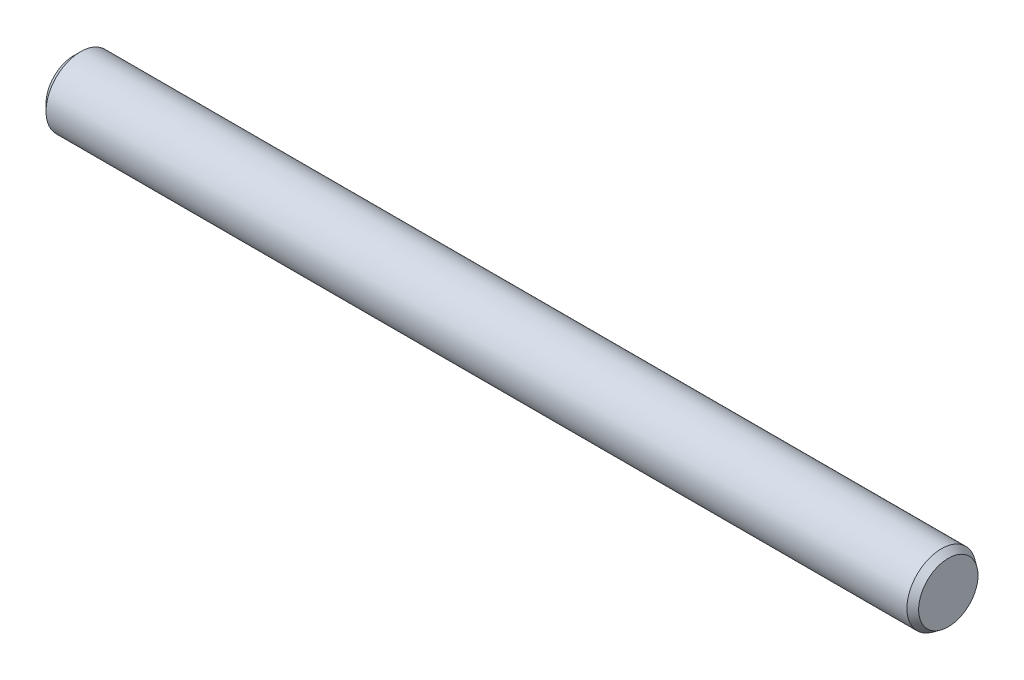
ISO-10303-21;
HEADER;
FILE_DESCRIPTION(('STEP AP214'),'2;1');
FILE_NAME('part.step','',(''),(''),'','','');
FILE_SCHEMA(('AUTOMOTIVE_DESIGN { 1 0 10303 214 1 1 1 1 }'));
ENDSEC;
DATA;
#1=APPLICATION_CONTEXT('core data for automotive mechanical design processes');
#2=APPLICATION_PROTOCOL_DEFINITION('international standard','automotive_design',2000,#1);
#3=PRODUCT_CONTEXT('',#1,'mechanical');
#4=PRODUCT('Part','Part','',(#3));
#5=PRODUCT_RELATED_PRODUCT_CATEGORY('part','',(#4));
#6=PRODUCT_DEFINITION_FORMATION('','',#4);
#7=PRODUCT_DEFINITION_CONTEXT('part definition',#1,'design');
#8=PRODUCT_DEFINITION('design','',#6,#7);
#9=PRODUCT_DEFINITION_SHAPE('','',#8);
#10=(LENGTH_UNIT() NAMED_UNIT(*) SI_UNIT(.MILLI.,.METRE.));
#11=(NAMED_UNIT(*) PLANE_ANGLE_UNIT() SI_UNIT($,.RADIAN.));
#12=(NAMED_UNIT(*) SI_UNIT($,.STERADIAN.) SOLID_ANGLE_UNIT());
#13=UNCERTAINTY_MEASURE_WITH_UNIT(LENGTH_MEASURE(1.E-05),#10,'distance_accuracy_value','');
#14=(GEOMETRIC_REPRESENTATION_CONTEXT(3) GLOBAL_UNCERTAINTY_ASSIGNED_CONTEXT((#13)) GLOBAL_UNIT_ASSIGNED_CONTEXT((#10,
#11,#12)) REPRESENTATION_CONTEXT('',''));
#15=CARTESIAN_POINT('',(0.,0.,0.));
#16=DIRECTION('',(0.,0.,1.));
#17=DIRECTION('',(1.,0.,0.));
#18=AXIS2_PLACEMENT_3D('',#15,#16,#17);
#19=CARTESIAN_POINT('',(-25.2,-39.1906604474953,-59.3361518326643));
#20=DIRECTION('',(1.,0.,0.));
#21=DIRECTION('',(0.,0.,-1.));
#22=AXIS2_PLACEMENT_3D('',#19,#20,#21);
#23=CYLINDRICAL_SURFACE('',#22,1.5);
#24=CARTESIAN_POINT('',(-24.9,-39.1906604474953,-59.3361518326643));
#25=DIRECTION('',(1.,0.,0.));
#26=DIRECTION('',(0.,0.,-1.));
#27=AXIS2_PLACEMENT_3D('',#24,#25,#26);
#28=CIRCLE('',#27,1.5);
#29=CARTESIAN_POINT('',(-24.9,-39.1906604474953,-60.8361518326643));
#30=VERTEX_POINT('',#29);
#31=EDGE_CURVE('E36',#30,#30,#28,.T.);
#32=ORIENTED_EDGE('',*,*,#31,.T.);
#33=EDGE_LOOP('',(#32));
#34=FACE_BOUND('',#33,.T.);
#35=CARTESIAN_POINT('',(12.5,-39.1906604474953,-59.3361518326643));
#36=DIRECTION('',(1.,0.,0.));
#37=DIRECTION('',(0.,0.,-1.));
#38=AXIS2_PLACEMENT_3D('',#35,#36,#37);
#39=CIRCLE('',#38,1.5);
#40=CARTESIAN_POINT('',(12.5,-39.1906604474953,-60.8361518326643));
#41=VERTEX_POINT('',#40);
#42=EDGE_CURVE('E40',#41,#41,#39,.F.);
#43=ORIENTED_EDGE('',*,*,#42,.T.);
#44=EDGE_LOOP('',(#43));
#45=FACE_BOUND('',#44,.T.);
#46=ADVANCED_FACE('F29',(#34,#45),#23,.T.);
#47=CARTESIAN_POINT('',(-25.2,-39.1906604474953,-59.3361518326643));
#48=DIRECTION('',(1.,0.,0.));
#49=DIRECTION('',(0.,0.,-1.));
#50=AXIS2_PLACEMENT_3D('',#47,#48,#49);
#51=PLANE('',#50);
#52=CARTESIAN_POINT('',(-25.2,-39.1906604474953,-59.3361518326643));
#53=DIRECTION('',(1.,0.,0.));
#54=DIRECTION('',(0.,0.,-1.));
#55=AXIS2_PLACEMENT_3D('',#52,#53,#54);
#56=CIRCLE('',#55,1.2);
#57=CARTESIAN_POINT('',(-25.2,-39.1906604474953,-60.5361518326643));
#58=VERTEX_POINT('',#57);
#59=EDGE_CURVE('E10',#58,#58,#56,.F.);
#60=ORIENTED_EDGE('',*,*,#59,.T.);
#61=EDGE_LOOP('',(#60));
#62=FACE_BOUND('',#61,.T.);
#63=ADVANCED_FACE('F60',(#62),#51,.F.);
#64=CARTESIAN_POINT('',(12.8,-39.1906604474953,-59.3361518326643));
#65=DIRECTION('',(1.,0.,0.));
#66=DIRECTION('',(0.,0.,-1.));
#67=AXIS2_PLACEMENT_3D('',#64,#65,#66);
#68=PLANE('',#67);
#69=CARTESIAN_POINT('',(12.8,-39.1906604474953,-59.3361518326643));
#70=DIRECTION('',(1.,0.,0.));
#71=DIRECTION('',(0.,0.,-1.));
#72=AXIS2_PLACEMENT_3D('',#69,#70,#71);
#73=CIRCLE('',#72,1.28993773853708);
#74=CARTESIAN_POINT('',(12.8,-39.1906604474953,-60.6260895712014));
#75=VERTEX_POINT('',#74);
#76=EDGE_CURVE('E44',#75,#75,#73,.T.);
#77=ORIENTED_EDGE('',*,*,#76,.T.);
#78=EDGE_LOOP('',(#77));
#79=FACE_BOUND('',#78,.T.);
#80=ADVANCED_FACE('F50',(#79),#68,.T.);
#81=CARTESIAN_POINT('',(12.8,-39.1906604474953,-59.3361518326643));
#82=DIRECTION('',(-1.,0.,0.));
#83=DIRECTION('',(0.,0.,1.));
#84=AXIS2_PLACEMENT_3D('',#81,#82,#83);
#85=CONICAL_SURFACE('',#84,1.28993773853708,0.610865238198019);
#86=ORIENTED_EDGE('',*,*,#42,.F.);
#87=EDGE_LOOP('',(#86));
#88=FACE_BOUND('',#87,.T.);
#89=ORIENTED_EDGE('',*,*,#76,.F.);
#90=EDGE_LOOP('',(#89));
#91=FACE_BOUND('',#90,.T.);
#92=ADVANCED_FACE('F52',(#88,#91),#85,.T.);
#93=CARTESIAN_POINT('',(-24.9,-39.1906604474953,-59.3361518326643));
#94=DIRECTION('',(1.,0.,0.));
#95=DIRECTION('',(0.,0.,-1.));
#96=AXIS2_PLACEMENT_3D('',#93,#94,#95);
#97=CONICAL_SURFACE('',#96,1.5,0.785398163397447);
#98=CARTESIAN_POINT('',(-25.2,-39.1906604474953,-60.5361518326643));
#99=CARTESIAN_POINT('',(-25.196875,-39.1906604474953,-60.5392768326643));
#100=CARTESIAN_POINT('',(-25.19375,-39.1906604474953,-60.5424018326643));
#101=CARTESIAN_POINT('',(-25.1875,-39.1906604474953,-60.5486518326643));
#102=CARTESIAN_POINT('',(-25.184375,-39.1906604474953,-60.5517768326643));
#103=CARTESIAN_POINT('',(-25.178125,-39.1906604474953,-60.5580268326643));
#104=CARTESIAN_POINT('',(-25.175,-39.1906604474953,-60.5611518326643));
#105=CARTESIAN_POINT('',(-25.16875,-39.1906604474953,-60.5674018326643));
#106=CARTESIAN_POINT('',(-25.165625,-39.1906604474953,-60.5705268326643));
#107=CARTESIAN_POINT('',(-25.159375,-39.1906604474953,-60.5767768326643));
#108=CARTESIAN_POINT('',(-25.15625,-39.1906604474953,-60.5799018326643));
#109=CARTESIAN_POINT('',(-25.15,-39.1906604474953,-60.5861518326643));
#110=CARTESIAN_POINT('',(-25.146875,-39.1906604474953,-60.5892768326643));
#111=CARTESIAN_POINT('',(-25.140625,-39.1906604474953,-60.5955268326643));
#112=CARTESIAN_POINT('',(-25.1375,-39.1906604474953,-60.5986518326643));
#113=CARTESIAN_POINT('',(-25.13125,-39.1906604474953,-60.6049018326643));
#114=CARTESIAN_POINT('',(-25.128125,-39.1906604474953,-60.6080268326643));
#115=CARTESIAN_POINT('',(-25.121875,-39.1906604474953,-60.6142768326643));
#116=CARTESIAN_POINT('',(-25.11875,-39.1906604474953,-60.6174018326643));
#117=CARTESIAN_POINT('',(-25.1125,-39.1906604474953,-60.6236518326643));
#118=CARTESIAN_POINT('',(-25.109375,-39.1906604474953,-60.6267768326643));
#119=CARTESIAN_POINT('',(-25.103125,-39.1906604474953,-60.6330268326643));
#120=CARTESIAN_POINT('',(-25.1,-39.1906604474953,-60.6361518326643));
#121=CARTESIAN_POINT('',(-25.09375,-39.1906604474953,-60.6424018326643));
#122=CARTESIAN_POINT('',(-25.090625,-39.1906604474953,-60.6455268326643));
#123=CARTESIAN_POINT('',(-25.084375,-39.1906604474953,-60.6517768326643));
#124=CARTESIAN_POINT('',(-25.08125,-39.1906604474953,-60.6549018326643));
#125=CARTESIAN_POINT('',(-25.075,-39.1906604474953,-60.6611518326643));
#126=CARTESIAN_POINT('',(-25.071875,-39.1906604474953,-60.6642768326643));
#127=CARTESIAN_POINT('',(-25.065625,-39.1906604474953,-60.6705268326643));
#128=CARTESIAN_POINT('',(-25.0625,-39.1906604474953,-60.6736518326643));
#129=CARTESIAN_POINT('',(-25.05625,-39.1906604474953,-60.6799018326643));
#130=CARTESIAN_POINT('',(-25.053125,-39.1906604474953,-60.6830268326643));
#131=CARTESIAN_POINT('',(-25.046875,-39.1906604474953,-60.6892768326643));
#132=CARTESIAN_POINT('',(-25.04375,-39.1906604474953,-60.6924018326643));
#133=CARTESIAN_POINT('',(-25.0375,-39.1906604474953,-60.6986518326643));
#134=CARTESIAN_POINT('',(-25.034375,-39.1906604474953,-60.7017768326643));
#135=CARTESIAN_POINT('',(-25.028125,-39.1906604474953,-60.7080268326643));
#136=CARTESIAN_POINT('',(-25.025,-39.1906604474953,-60.7111518326643));
#137=CARTESIAN_POINT('',(-25.01875,-39.1906604474953,-60.7174018326643));
#138=CARTESIAN_POINT('',(-25.015625,-39.1906604474953,-60.7205268326643));
#139=CARTESIAN_POINT('',(-25.009375,-39.1906604474953,-60.7267768326643));
#140=CARTESIAN_POINT('',(-25.00625,-39.1906604474953,-60.7299018326643));
#141=CARTESIAN_POINT('',(-25.,-39.1906604474953,-60.7361518326643));
#142=CARTESIAN_POINT('',(-24.996875,-39.1906604474953,-60.7392768326643));
#143=CARTESIAN_POINT('',(-24.990625,-39.1906604474953,-60.7455268326643));
#144=CARTESIAN_POINT('',(-24.9875,-39.1906604474953,-60.7486518326643));
#145=CARTESIAN_POINT('',(-24.98125,-39.1906604474953,-60.7549018326643));
#146=CARTESIAN_POINT('',(-24.978125,-39.1906604474953,-60.7580268326643));
#147=CARTESIAN_POINT('',(-24.971875,-39.1906604474953,-60.7642768326643));
#148=CARTESIAN_POINT('',(-24.96875,-39.1906604474953,-60.7674018326643));
#149=CARTESIAN_POINT('',(-24.9625,-39.1906604474953,-60.7736518326643));
#150=CARTESIAN_POINT('',(-24.959375,-39.1906604474953,-60.7767768326643));
#151=CARTESIAN_POINT('',(-24.953125,-39.1906604474953,-60.7830268326643));
#152=CARTESIAN_POINT('',(-24.95,-39.1906604474953,-60.7861518326643));
#153=CARTESIAN_POINT('',(-24.94375,-39.1906604474953,-60.7924018326643));
#154=CARTESIAN_POINT('',(-24.940625,-39.1906604474953,-60.7955268326643));
#155=CARTESIAN_POINT('',(-24.934375,-39.1906604474953,-60.8017768326643));
#156=CARTESIAN_POINT('',(-24.93125,-39.1906604474953,-60.8049018326643));
#157=CARTESIAN_POINT('',(-24.925,-39.1906604474953,-60.8111518326643));
#158=CARTESIAN_POINT('',(-24.921875,-39.1906604474953,-60.8142768326643));
#159=CARTESIAN_POINT('',(-24.915625,-39.1906604474953,-60.8205268326643));
#160=CARTESIAN_POINT('',(-24.9125,-39.1906604474953,-60.8236518326643));
#161=CARTESIAN_POINT('',(-24.90625,-39.1906604474953,-60.8299018326643));
#162=CARTESIAN_POINT('',(-24.903125,-39.1906604474953,-60.8330268326643));
#163=CARTESIAN_POINT('',(-24.9,-39.1906604474953,-60.8361518326643));
#164=B_SPLINE_CURVE_WITH_KNOTS('',3,(#98,#99,#100,#101,#102,#103,#104,#105,#106,#107,#108,#109,
#110,#111,#112,#113,#114,#115,#116,#117,#118,#119,#120,#121,#122,#123,#124,#125,#126,#127,#128,
#129,#130,#131,#132,#133,#134,#135,#136,#137,#138,#139,#140,#141,#142,#143,#144,#145,#146,#147,
#148,#149,#150,#151,#152,#153,#154,#155,#156,#157,#158,#159,#160,#161,#162,#163),.UNSPECIFIED.,
.F.,.F.,(4,2,2,2,2,2,2,2,2,2,2,2,2,2,2,2,2,2,2,2,2,2,2,2,2,2,2,2,2,2,2,2,4),(0.,
0.0132582521472488,0.0265165042944951,0.0397747564417438,0.0530330085889901,0.0662912607362414,
0.0795495128834901,0.0928077650307364,0.106066017177983,0.119324269325231,0.132582521472478,
0.145840773619729,0.159099025766978,0.172357277914224,0.18561553006147,0.198873782208719,
0.212132034355965,0.225390286503217,0.238648538650465,0.251906790797712,0.265165042944958,
0.278423295092207,0.291681547239453,0.304939799386704,0.318198051533953,0.331456303681199,
0.344714555828446,0.357972807975694,0.371231060122941,0.384489312270192,0.397747564417441,
0.411005816564687,0.424264068711936),.UNSPECIFIED.);
#165=EDGE_CURVE('BSEAM31',#58,#30,#164,.T.);
#166=ORIENTED_EDGE('',*,*,#59,.F.);
#167=ORIENTED_EDGE('',*,*,#31,.F.);
#168=ORIENTED_EDGE('',*,*,#165,.T.);
#169=ORIENTED_EDGE('',*,*,#165,.F.);
#170=EDGE_LOOP('',(#166,#168,#167,#169));
#171=FACE_BOUND('',#170,.T.);
#172=ADVANCED_FACE('F31',(#171),#97,.T.);
#173=CLOSED_SHELL('',(#46,#63,#80,#92,#172));
#174=MANIFOLD_SOLID_BREP('B2',#173);
#175=ADVANCED_BREP_SHAPE_REPRESENTATION('',(#18,#174),#14);
#176=SHAPE_DEFINITION_REPRESENTATION(#9,#175);
ENDSEC;
END-ISO-10303-21;
